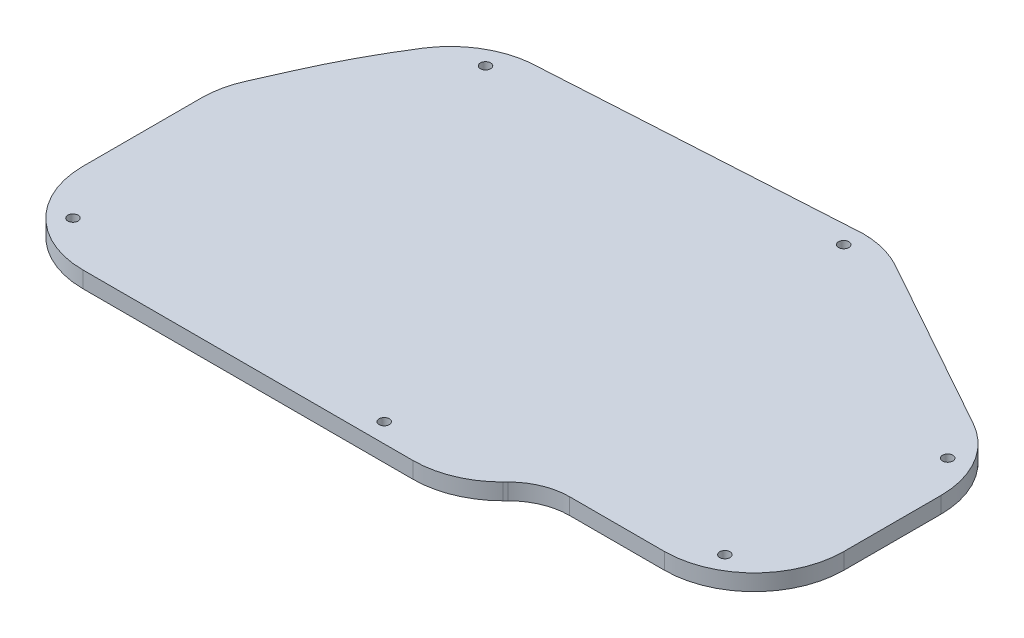
ISO-10303-21;
HEADER;
FILE_DESCRIPTION(('STEP AP214'),'2;1');
FILE_NAME('part.step','',(''),(''),'','','');
FILE_SCHEMA(('AUTOMOTIVE_DESIGN { 1 0 10303 214 1 1 1 1 }'));
ENDSEC;
DATA;
#1=APPLICATION_CONTEXT('core data for automotive mechanical design processes');
#2=APPLICATION_PROTOCOL_DEFINITION('international standard','automotive_design',2000,#1);
#3=PRODUCT_CONTEXT('',#1,'mechanical');
#4=PRODUCT('Part','Part','',(#3));
#5=PRODUCT_RELATED_PRODUCT_CATEGORY('part','',(#4));
#6=PRODUCT_DEFINITION_FORMATION('','',#4);
#7=PRODUCT_DEFINITION_CONTEXT('part definition',#1,'design');
#8=PRODUCT_DEFINITION('design','',#6,#7);
#9=PRODUCT_DEFINITION_SHAPE('','',#8);
#10=(LENGTH_UNIT() NAMED_UNIT(*) SI_UNIT(.MILLI.,.METRE.));
#11=(NAMED_UNIT(*) PLANE_ANGLE_UNIT() SI_UNIT($,.RADIAN.));
#12=(NAMED_UNIT(*) SI_UNIT($,.STERADIAN.) SOLID_ANGLE_UNIT());
#13=UNCERTAINTY_MEASURE_WITH_UNIT(LENGTH_MEASURE(1.E-05),#10,'distance_accuracy_value','');
#14=(GEOMETRIC_REPRESENTATION_CONTEXT(3) GLOBAL_UNCERTAINTY_ASSIGNED_CONTEXT((#13)) GLOBAL_UNIT_ASSIGNED_CONTEXT((#10,
#11,#12)) REPRESENTATION_CONTEXT('',''));
#15=CARTESIAN_POINT('',(0.,0.,0.));
#16=DIRECTION('',(0.,0.,1.));
#17=DIRECTION('',(1.,0.,0.));
#18=AXIS2_PLACEMENT_3D('',#15,#16,#17);
#19=CARTESIAN_POINT('',(-257.825636599929,3.175,88.130010280707));
#20=DIRECTION('',(0.,1.,0.));
#21=DIRECTION('',(0.,0.,1.));
#22=AXIS2_PLACEMENT_3D('',#19,#20,#21);
#23=PLANE('',#22);
#24=CARTESIAN_POINT('',(-267.548354841244,3.175,97.8527285220219));
#25=DIRECTION('',(0.,1.,0.));
#26=DIRECTION('',(0.,0.,1.));
#27=AXIS2_PLACEMENT_3D('',#24,#25,#26);
#28=CIRCLE('',#27,0.999999999999998);
#29=CARTESIAN_POINT('',(-267.548354841244,3.175,98.8527285220219));
#30=VERTEX_POINT('',#29);
#31=EDGE_CURVE('E368',#30,#30,#28,.T.);
#32=ORIENTED_EDGE('',*,*,#31,.F.);
#33=EDGE_LOOP('',(#32));
#34=FACE_BOUND('',#33,.T.);
#35=CARTESIAN_POINT('',(-187.963906245359,3.175,27.219493821026));
#36=DIRECTION('',(0.,1.,0.));
#37=DIRECTION('',(0.,0.,1.));
#38=AXIS2_PLACEMENT_3D('',#35,#36,#37);
#39=CIRCLE('',#38,0.999999999999998);
#40=CARTESIAN_POINT('',(-187.963906245359,3.175,28.2194938210259));
#41=VERTEX_POINT('',#40);
#42=EDGE_CURVE('E380',#41,#41,#39,.T.);
#43=ORIENTED_EDGE('',*,*,#42,.F.);
#44=EDGE_LOOP('',(#43));
#45=FACE_BOUND('',#44,.T.);
#46=CARTESIAN_POINT('',(-147.207602144608,3.175,91.1272884977668));
#47=DIRECTION('',(0.,1.,0.));
#48=DIRECTION('',(0.,0.,1.));
#49=AXIS2_PLACEMENT_3D('',#46,#47,#48);
#50=CIRCLE('',#49,0.999999999999998);
#51=CARTESIAN_POINT('',(-147.207602144608,3.175,92.1272884977668));
#52=VERTEX_POINT('',#51);
#53=EDGE_CURVE('E192',#52,#52,#50,.T.);
#54=ORIENTED_EDGE('',*,*,#53,.F.);
#55=EDGE_LOOP('',(#54));
#56=FACE_BOUND('',#55,.T.);
#57=CARTESIAN_POINT('',(-257.825636599929,3.175,88.130010280707));
#58=DIRECTION('',(0.,1.,0.));
#59=DIRECTION('',(0.,0.,1.));
#60=AXIS2_PLACEMENT_3D('',#57,#58,#59);
#61=CIRCLE('',#60,17.5);
#62=CARTESIAN_POINT('',(-275.325636599929,3.175,88.1300102807068));
#63=VERTEX_POINT('',#62);
#64=CARTESIAN_POINT('',(-257.825636599926,3.175,105.630010280707));
#65=VERTEX_POINT('',#64);
#66=EDGE_CURVE('E221',#63,#65,#61,.T.);
#67=ORIENTED_EDGE('',*,*,#66,.T.);
#68=DIRECTION('',(1.,0.,0.));
#69=VECTOR('',#68,1.);
#70=CARTESIAN_POINT('',(-257.825636599926,3.175,105.630010280707));
#71=LINE('',#70,#69);
#72=CARTESIAN_POINT('',(-193.494425739186,3.175,105.630010280707));
#73=VERTEX_POINT('',#72);
#74=EDGE_CURVE('E124',#65,#73,#71,.T.);
#75=ORIENTED_EDGE('',*,*,#74,.T.);
#76=CARTESIAN_POINT('',(-193.494425739186,3.175,88.130010280707));
#77=DIRECTION('',(0.,1.,0.));
#78=DIRECTION('',(0.,0.,1.));
#79=AXIS2_PLACEMENT_3D('',#76,#77,#78);
#80=CIRCLE('',#79,17.5);
#81=CARTESIAN_POINT('',(-181.120057068421,3.175,100.504378951472));
#82=VERTEX_POINT('',#81);
#83=EDGE_CURVE('E263',#73,#82,#80,.T.);
#84=ORIENTED_EDGE('',*,*,#83,.T.);
#85=DIRECTION('',(0.707106781186528,0.,-0.707106781186567));
#86=VECTOR('',#85,1.);
#87=CARTESIAN_POINT('',(-181.120057068421,3.175,100.504378951472));
#88=LINE('',#87,#86);
#89=CARTESIAN_POINT('',(-180.610104454432,3.175,99.9944263374824));
#90=VERTEX_POINT('',#89);
#91=EDGE_CURVE('E282',#82,#90,#88,.T.);
#92=ORIENTED_EDGE('',*,*,#91,.T.);
#93=CARTESIAN_POINT('',(-172.124823080193,3.175,108.479707711721));
#94=DIRECTION('',(0.,-1.,0.));
#95=DIRECTION('',(0.,0.,1.));
#96=AXIS2_PLACEMENT_3D('',#93,#94,#95);
#97=CIRCLE('',#96,12.);
#98=CARTESIAN_POINT('',(-172.124823080193,3.175,96.4797077117209));
#99=VERTEX_POINT('',#98);
#100=EDGE_CURVE('E279',#90,#99,#97,.T.);
#101=ORIENTED_EDGE('',*,*,#100,.T.);
#102=DIRECTION('',(1.,0.,0.));
#103=VECTOR('',#102,1.);
#104=CARTESIAN_POINT('',(-172.124823080193,3.175,96.4797077117209));
#105=LINE('',#104,#103);
#106=CARTESIAN_POINT('',(-153.649556898133,3.175,96.4797077117206));
#107=VERTEX_POINT('',#106);
#108=EDGE_CURVE('E281',#99,#107,#105,.T.);
#109=ORIENTED_EDGE('',*,*,#108,.T.);
#110=CARTESIAN_POINT('',(-153.649556898131,3.175,78.9797077117209));
#111=DIRECTION('',(0.,1.,0.));
#112=DIRECTION('',(0.,0.,1.));
#113=AXIS2_PLACEMENT_3D('',#110,#111,#112);
#114=CIRCLE('',#113,17.4999999999996);
#115=CARTESIAN_POINT('',(-136.149556898132,3.175,78.979707711718));
#116=VERTEX_POINT('',#115);
#117=EDGE_CURVE('E284',#107,#116,#114,.T.);
#118=ORIENTED_EDGE('',*,*,#117,.T.);
#119=DIRECTION('',(0.,0.,-1.));
#120=VECTOR('',#119,1.);
#121=CARTESIAN_POINT('',(-136.149556898132,3.175,78.979707711718));
#122=LINE('',#121,#120);
#123=CARTESIAN_POINT('',(-136.149556898131,3.175,60.0820712296497));
#124=VERTEX_POINT('',#123);
#125=EDGE_CURVE('E290',#116,#124,#122,.T.);
#126=ORIENTED_EDGE('',*,*,#125,.T.);
#127=CARTESIAN_POINT('',(-153.649556898131,3.175,60.0820712296482));
#128=DIRECTION('',(0.,1.,0.));
#129=DIRECTION('',(0.,0.,1.));
#130=AXIS2_PLACEMENT_3D('',#127,#128,#129);
#131=CIRCLE('',#130,17.5);
#132=CARTESIAN_POINT('',(-145.134111059737,3.175,44.7936055717288));
#133=VERTEX_POINT('',#132);
#134=EDGE_CURVE('E292',#124,#133,#131,.T.);
#135=ORIENTED_EDGE('',*,*,#134,.T.);
#136=DIRECTION('',(-0.873626609023966,0.,-0.486596905051077));
#137=VECTOR('',#136,1.);
#138=CARTESIAN_POINT('',(-145.134111059737,3.175,44.7936055717288));
#139=LINE('',#138,#137);
#140=CARTESIAN_POINT('',(-179.448460406965,3.175,25.6810281631066));
#141=VERTEX_POINT('',#140);
#142=EDGE_CURVE('E294',#133,#141,#139,.T.);
#143=ORIENTED_EDGE('',*,*,#142,.T.);
#144=CARTESIAN_POINT('',(-187.963906245359,3.175,40.9694938210259));
#145=DIRECTION('',(0.,1.,0.));
#146=DIRECTION('',(0.,0.,1.));
#147=AXIS2_PLACEMENT_3D('',#144,#145,#146);
#148=CIRCLE('',#147,17.5);
#149=CARTESIAN_POINT('',(-187.963906245359,3.175,23.4694938210259));
#150=VERTEX_POINT('',#149);
#151=EDGE_CURVE('E296',#141,#150,#148,.T.);
#152=ORIENTED_EDGE('',*,*,#151,.T.);
#153=DIRECTION('',(-0.99827097221074,0.,0.058779809811052));
#154=VECTOR('',#153,1.);
#155=CARTESIAN_POINT('',(-187.963906245359,3.175,23.4694938210259));
#156=LINE('',#155,#154);
#157=CARTESIAN_POINT('',(-247.380541868139,3.175,26.9680414486157));
#158=VERTEX_POINT('',#157);
#159=EDGE_CURVE('E298',#150,#158,#156,.T.);
#160=ORIENTED_EDGE('',*,*,#159,.T.);
#161=CARTESIAN_POINT('',(-247.380541868139,3.175,44.4680414486157));
#162=DIRECTION('',(0.,1.,0.));
#163=DIRECTION('',(0.,0.,1.));
#164=AXIS2_PLACEMENT_3D('',#161,#162,#163);
#165=CIRCLE('',#164,17.5);
#166=CARTESIAN_POINT('',(-262.154750086511,3.175,35.0886613240974));
#167=VERTEX_POINT('',#166);
#168=EDGE_CURVE('E300',#158,#167,#165,.T.);
#169=ORIENTED_EDGE('',*,*,#168,.T.);
#170=CARTESIAN_POINT('',(-154.715336031883,3.175,103.29638453195));
#171=DIRECTION('',(0.,1.,0.));
#172=DIRECTION('',(0.,0.,1.));
#173=AXIS2_PLACEMENT_3D('',#170,#171,#172);
#174=CIRCLE('',#173,127.261624999844);
#175=CARTESIAN_POINT('',(-271.025140144185,3.175,51.6480480150906));
#176=VERTEX_POINT('',#175);
#177=EDGE_CURVE('E170',#167,#176,#174,.T.);
#178=ORIENTED_EDGE('',*,*,#177,.T.);
#179=DIRECTION('',(-0.405843760968182,0.,0.913942471758043));
#180=VECTOR('',#179,1.);
#181=CARTESIAN_POINT('',(-271.025140144185,3.175,51.6480480150906));
#182=LINE('',#181,#180);
#183=CARTESIAN_POINT('',(-273.819629855694,3.175,57.9411171216515));
#184=VERTEX_POINT('',#183);
#185=EDGE_CURVE('E164',#176,#184,#182,.T.);
#186=ORIENTED_EDGE('',*,*,#185,.T.);
#187=CARTESIAN_POINT('',(-257.825636599929,3.175,65.0433829385948));
#188=DIRECTION('',(0.,1.,0.));
#189=DIRECTION('',(0.,0.,1.));
#190=AXIS2_PLACEMENT_3D('',#187,#188,#189);
#191=CIRCLE('',#190,17.5);
#192=CARTESIAN_POINT('',(-275.325636599929,3.175,65.0433829385949));
#193=VERTEX_POINT('',#192);
#194=EDGE_CURVE('E168',#184,#193,#191,.T.);
#195=ORIENTED_EDGE('',*,*,#194,.T.);
#196=DIRECTION('',(0.,0.,1.));
#197=VECTOR('',#196,1.);
#198=CARTESIAN_POINT('',(-275.325636599929,3.175,65.0433829385949));
#199=LINE('',#198,#197);
#200=EDGE_CURVE('E54',#193,#63,#199,.T.);
#201=ORIENTED_EDGE('',*,*,#200,.T.);
#202=EDGE_LOOP('',(#67,#75,#84,#92,#101,#109,#118,#126,#135,#143,#152,#160,#169,#178,#186,#195,#201));
#203=FACE_BOUND('',#202,.T.);
#204=CARTESIAN_POINT('',(-141.795027650598,3.175,53.1155343339314));
#205=DIRECTION('',(0.,1.,0.));
#206=DIRECTION('',(0.,0.,1.));
#207=AXIS2_PLACEMENT_3D('',#204,#205,#206);
#208=CIRCLE('',#207,0.999999999999998);
#209=CARTESIAN_POINT('',(-141.795027650598,3.175,54.1155343339314));
#210=VERTEX_POINT('',#209);
#211=EDGE_CURVE('E386',#210,#210,#208,.T.);
#212=ORIENTED_EDGE('',*,*,#211,.F.);
#213=EDGE_LOOP('',(#212));
#214=FACE_BOUND('',#213,.T.);
#215=CARTESIAN_POINT('',(-253.051529835332,3.175,31.9419728125291));
#216=DIRECTION('',(0.,1.,0.));
#217=DIRECTION('',(0.,0.,1.));
#218=AXIS2_PLACEMENT_3D('',#215,#216,#217);
#219=CIRCLE('',#218,0.999999999999998);
#220=CARTESIAN_POINT('',(-253.051529835332,3.175,32.9419728125291));
#221=VERTEX_POINT('',#220);
#222=EDGE_CURVE('E374',#221,#221,#219,.T.);
#223=ORIENTED_EDGE('',*,*,#222,.F.);
#224=EDGE_LOOP('',(#223));
#225=FACE_BOUND('',#224,.T.);
#226=CARTESIAN_POINT('',(-202.85468143992,3.175,101.880010280707));
#227=DIRECTION('',(0.,1.,0.));
#228=DIRECTION('',(0.,0.,1.));
#229=AXIS2_PLACEMENT_3D('',#226,#227,#228);
#230=CIRCLE('',#229,0.999999999999998);
#231=CARTESIAN_POINT('',(-202.85468143992,3.175,102.880010280707));
#232=VERTEX_POINT('',#231);
#233=EDGE_CURVE('E359',#232,#232,#230,.T.);
#234=ORIENTED_EDGE('',*,*,#233,.F.);
#235=EDGE_LOOP('',(#234));
#236=FACE_BOUND('',#235,.T.);
#237=ADVANCED_FACE('F37',(#34,#45,#56,#203,#214,#225,#236),#23,.T.);
#238=CARTESIAN_POINT('',(-257.825636599929,0.,88.130010280707));
#239=DIRECTION('',(0.,1.,0.));
#240=DIRECTION('',(0.,0.,1.));
#241=AXIS2_PLACEMENT_3D('',#238,#239,#240);
#242=PLANE('',#241);
#243=CARTESIAN_POINT('',(-257.825636599929,0.,88.130010280707));
#244=DIRECTION('',(0.,1.,0.));
#245=DIRECTION('',(0.,0.,1.));
#246=AXIS2_PLACEMENT_3D('',#243,#244,#245);
#247=CIRCLE('',#246,17.5);
#248=CARTESIAN_POINT('',(-275.325636599929,0.,88.1300102807068));
#249=VERTEX_POINT('',#248);
#250=CARTESIAN_POINT('',(-257.825636599926,0.,105.630010280707));
#251=VERTEX_POINT('',#250);
#252=EDGE_CURVE('E188',#249,#251,#247,.T.);
#253=ORIENTED_EDGE('',*,*,#252,.F.);
#254=DIRECTION('',(0.,0.,1.));
#255=VECTOR('',#254,1.);
#256=CARTESIAN_POINT('',(-275.325636599929,0.,65.0433829385949));
#257=LINE('',#256,#255);
#258=CARTESIAN_POINT('',(-275.325636599929,0.,65.0433829385949));
#259=VERTEX_POINT('',#258);
#260=EDGE_CURVE('E116',#259,#249,#257,.T.);
#261=ORIENTED_EDGE('',*,*,#260,.F.);
#262=CARTESIAN_POINT('',(-257.825636599929,0.,65.0433829385948));
#263=DIRECTION('',(0.,1.,0.));
#264=DIRECTION('',(0.,0.,1.));
#265=AXIS2_PLACEMENT_3D('',#262,#263,#264);
#266=CIRCLE('',#265,17.5);
#267=CARTESIAN_POINT('',(-273.819629855694,0.,57.9411171216515));
#268=VERTEX_POINT('',#267);
#269=EDGE_CURVE('E110',#268,#259,#266,.T.);
#270=ORIENTED_EDGE('',*,*,#269,.F.);
#271=DIRECTION('',(-0.405843760968182,0.,0.913942471758043));
#272=VECTOR('',#271,1.);
#273=CARTESIAN_POINT('',(-271.025140144185,0.,51.6480480150906));
#274=LINE('',#273,#272);
#275=CARTESIAN_POINT('',(-271.025140144185,0.,51.6480480150906));
#276=VERTEX_POINT('',#275);
#277=EDGE_CURVE('E178',#276,#268,#274,.T.);
#278=ORIENTED_EDGE('',*,*,#277,.F.);
#279=CARTESIAN_POINT('',(-154.715336031883,0.,103.29638453195));
#280=DIRECTION('',(0.,1.,0.));
#281=DIRECTION('',(0.,0.,1.));
#282=AXIS2_PLACEMENT_3D('',#279,#280,#281);
#283=CIRCLE('',#282,127.261624999844);
#284=CARTESIAN_POINT('',(-262.154750086511,0.,35.0886613240974));
#285=VERTEX_POINT('',#284);
#286=EDGE_CURVE('E216',#285,#276,#283,.T.);
#287=ORIENTED_EDGE('',*,*,#286,.F.);
#288=CARTESIAN_POINT('',(-247.380541868139,0.,44.4680414486157));
#289=DIRECTION('',(0.,1.,0.));
#290=DIRECTION('',(0.,0.,1.));
#291=AXIS2_PLACEMENT_3D('',#288,#289,#290);
#292=CIRCLE('',#291,17.5);
#293=CARTESIAN_POINT('',(-247.380541868139,0.,26.9680414486157));
#294=VERTEX_POINT('',#293);
#295=EDGE_CURVE('E214',#294,#285,#292,.T.);
#296=ORIENTED_EDGE('',*,*,#295,.F.);
#297=DIRECTION('',(-0.99827097221074,0.,0.058779809811052));
#298=VECTOR('',#297,1.);
#299=CARTESIAN_POINT('',(-187.963906245359,0.,23.4694938210259));
#300=LINE('',#299,#298);
#301=CARTESIAN_POINT('',(-187.963906245359,0.,23.4694938210259));
#302=VERTEX_POINT('',#301);
#303=EDGE_CURVE('E212',#302,#294,#300,.T.);
#304=ORIENTED_EDGE('',*,*,#303,.F.);
#305=CARTESIAN_POINT('',(-187.963906245359,0.,40.9694938210259));
#306=DIRECTION('',(0.,1.,0.));
#307=DIRECTION('',(0.,0.,1.));
#308=AXIS2_PLACEMENT_3D('',#305,#306,#307);
#309=CIRCLE('',#308,17.5);
#310=CARTESIAN_POINT('',(-179.448460406965,0.,25.6810281631066));
#311=VERTEX_POINT('',#310);
#312=EDGE_CURVE('E210',#311,#302,#309,.T.);
#313=ORIENTED_EDGE('',*,*,#312,.F.);
#314=DIRECTION('',(-0.873626609023966,0.,-0.486596905051077));
#315=VECTOR('',#314,1.);
#316=CARTESIAN_POINT('',(-145.134111059737,0.,44.7936055717288));
#317=LINE('',#316,#315);
#318=CARTESIAN_POINT('',(-145.134111059737,0.,44.7936055717288));
#319=VERTEX_POINT('',#318);
#320=EDGE_CURVE('E208',#319,#311,#317,.T.);
#321=ORIENTED_EDGE('',*,*,#320,.F.);
#322=CARTESIAN_POINT('',(-153.649556898131,0.,60.0820712296482));
#323=DIRECTION('',(0.,1.,0.));
#324=DIRECTION('',(0.,0.,1.));
#325=AXIS2_PLACEMENT_3D('',#322,#323,#324);
#326=CIRCLE('',#325,17.5);
#327=CARTESIAN_POINT('',(-136.149556898131,0.,60.0820712296497));
#328=VERTEX_POINT('',#327);
#329=EDGE_CURVE('E206',#328,#319,#326,.T.);
#330=ORIENTED_EDGE('',*,*,#329,.F.);
#331=DIRECTION('',(0.,0.,-1.));
#332=VECTOR('',#331,1.);
#333=CARTESIAN_POINT('',(-136.149556898132,0.,78.979707711718));
#334=LINE('',#333,#332);
#335=CARTESIAN_POINT('',(-136.149556898132,0.,78.979707711718));
#336=VERTEX_POINT('',#335);
#337=EDGE_CURVE('E204',#336,#328,#334,.T.);
#338=ORIENTED_EDGE('',*,*,#337,.F.);
#339=CARTESIAN_POINT('',(-153.649556898131,0.,78.9797077117209));
#340=DIRECTION('',(0.,1.,0.));
#341=DIRECTION('',(0.,0.,1.));
#342=AXIS2_PLACEMENT_3D('',#339,#340,#341);
#343=CIRCLE('',#342,17.4999999999996);
#344=CARTESIAN_POINT('',(-153.649556898133,0.,96.4797077117206));
#345=VERTEX_POINT('',#344);
#346=EDGE_CURVE('E202',#345,#336,#343,.T.);
#347=ORIENTED_EDGE('',*,*,#346,.F.);
#348=DIRECTION('',(1.,0.,0.));
#349=VECTOR('',#348,1.);
#350=CARTESIAN_POINT('',(-172.124823080193,0.,96.4797077117209));
#351=LINE('',#350,#349);
#352=CARTESIAN_POINT('',(-172.124823080193,0.,96.4797077117209));
#353=VERTEX_POINT('',#352);
#354=EDGE_CURVE('E200',#353,#345,#351,.T.);
#355=ORIENTED_EDGE('',*,*,#354,.F.);
#356=CARTESIAN_POINT('',(-172.124823080193,0.,108.479707711721));
#357=DIRECTION('',(0.,-1.,0.));
#358=DIRECTION('',(0.,0.,1.));
#359=AXIS2_PLACEMENT_3D('',#356,#357,#358);
#360=CIRCLE('',#359,12.);
#361=CARTESIAN_POINT('',(-180.610104454432,0.,99.9944263374824));
#362=VERTEX_POINT('',#361);
#363=EDGE_CURVE('E198',#362,#353,#360,.T.);
#364=ORIENTED_EDGE('',*,*,#363,.F.);
#365=DIRECTION('',(0.707106781186528,0.,-0.707106781186567));
#366=VECTOR('',#365,1.);
#367=CARTESIAN_POINT('',(-181.120057068421,0.,100.504378951472));
#368=LINE('',#367,#366);
#369=CARTESIAN_POINT('',(-181.120057068421,0.,100.504378951472));
#370=VERTEX_POINT('',#369);
#371=EDGE_CURVE('E196',#370,#362,#368,.T.);
#372=ORIENTED_EDGE('',*,*,#371,.F.);
#373=CARTESIAN_POINT('',(-193.494425739186,0.,88.130010280707));
#374=DIRECTION('',(0.,1.,0.));
#375=DIRECTION('',(0.,0.,1.));
#376=AXIS2_PLACEMENT_3D('',#373,#374,#375);
#377=CIRCLE('',#376,17.5);
#378=CARTESIAN_POINT('',(-193.494425739186,0.,105.630010280707));
#379=VERTEX_POINT('',#378);
#380=EDGE_CURVE('E194',#379,#370,#377,.T.);
#381=ORIENTED_EDGE('',*,*,#380,.F.);
#382=DIRECTION('',(1.,0.,0.));
#383=VECTOR('',#382,1.);
#384=CARTESIAN_POINT('',(-257.825636599926,0.,105.630010280707));
#385=LINE('',#384,#383);
#386=EDGE_CURVE('E191',#251,#379,#385,.T.);
#387=ORIENTED_EDGE('',*,*,#386,.F.);
#388=EDGE_LOOP('',(#253,#261,#270,#278,#287,#296,#304,#313,#321,#330,#338,#347,#355,#364,#372,
#381,#387));
#389=FACE_BOUND('',#388,.T.);
#390=CARTESIAN_POINT('',(-147.207602144608,0.,91.1272884977668));
#391=DIRECTION('',(0.,1.,0.));
#392=DIRECTION('',(0.,0.,1.));
#393=AXIS2_PLACEMENT_3D('',#390,#391,#392);
#394=CIRCLE('',#393,0.999999999999998);
#395=CARTESIAN_POINT('',(-147.207602144608,0.,92.1272884977668));
#396=VERTEX_POINT('',#395);
#397=EDGE_CURVE('E389',#396,#396,#394,.T.);
#398=ORIENTED_EDGE('',*,*,#397,.T.);
#399=EDGE_LOOP('',(#398));
#400=FACE_BOUND('',#399,.T.);
#401=CARTESIAN_POINT('',(-141.795027650598,0.,53.1155343339314));
#402=DIRECTION('',(0.,1.,0.));
#403=DIRECTION('',(0.,0.,1.));
#404=AXIS2_PLACEMENT_3D('',#401,#402,#403);
#405=CIRCLE('',#404,0.999999999999998);
#406=CARTESIAN_POINT('',(-141.795027650598,0.,54.1155343339314));
#407=VERTEX_POINT('',#406);
#408=EDGE_CURVE('E383',#407,#407,#405,.T.);
#409=ORIENTED_EDGE('',*,*,#408,.T.);
#410=EDGE_LOOP('',(#409));
#411=FACE_BOUND('',#410,.T.);
#412=CARTESIAN_POINT('',(-187.963906245359,0.,27.219493821026));
#413=DIRECTION('',(0.,1.,0.));
#414=DIRECTION('',(0.,0.,1.));
#415=AXIS2_PLACEMENT_3D('',#412,#413,#414);
#416=CIRCLE('',#415,0.999999999999998);
#417=CARTESIAN_POINT('',(-187.963906245359,0.,28.2194938210259));
#418=VERTEX_POINT('',#417);
#419=EDGE_CURVE('E377',#418,#418,#416,.T.);
#420=ORIENTED_EDGE('',*,*,#419,.T.);
#421=EDGE_LOOP('',(#420));
#422=FACE_BOUND('',#421,.T.);
#423=CARTESIAN_POINT('',(-253.051529835332,0.,31.9419728125291));
#424=DIRECTION('',(0.,1.,0.));
#425=DIRECTION('',(0.,0.,1.));
#426=AXIS2_PLACEMENT_3D('',#423,#424,#425);
#427=CIRCLE('',#426,0.999999999999998);
#428=CARTESIAN_POINT('',(-253.051529835332,0.,32.9419728125291));
#429=VERTEX_POINT('',#428);
#430=EDGE_CURVE('E371',#429,#429,#427,.T.);
#431=ORIENTED_EDGE('',*,*,#430,.T.);
#432=EDGE_LOOP('',(#431));
#433=FACE_BOUND('',#432,.T.);
#434=CARTESIAN_POINT('',(-267.548354841244,0.,97.8527285220219));
#435=DIRECTION('',(0.,1.,0.));
#436=DIRECTION('',(0.,0.,1.));
#437=AXIS2_PLACEMENT_3D('',#434,#435,#436);
#438=CIRCLE('',#437,0.999999999999998);
#439=CARTESIAN_POINT('',(-267.548354841244,0.,98.8527285220219));
#440=VERTEX_POINT('',#439);
#441=EDGE_CURVE('E365',#440,#440,#438,.T.);
#442=ORIENTED_EDGE('',*,*,#441,.T.);
#443=EDGE_LOOP('',(#442));
#444=FACE_BOUND('',#443,.T.);
#445=CARTESIAN_POINT('',(-202.85468143992,0.,101.880010280707));
#446=DIRECTION('',(0.,1.,0.));
#447=DIRECTION('',(0.,0.,1.));
#448=AXIS2_PLACEMENT_3D('',#445,#446,#447);
#449=CIRCLE('',#448,0.999999999999998);
#450=CARTESIAN_POINT('',(-202.85468143992,0.,102.880010280707));
#451=VERTEX_POINT('',#450);
#452=EDGE_CURVE('E362',#451,#451,#449,.T.);
#453=ORIENTED_EDGE('',*,*,#452,.T.);
#454=EDGE_LOOP('',(#453));
#455=FACE_BOUND('',#454,.T.);
#456=ADVANCED_FACE('F267',(#389,#400,#411,#422,#433,#444,#455),#242,.F.);
#457=CARTESIAN_POINT('',(-257.825636599929,3.175,88.130010280707));
#458=DIRECTION('',(0.,-1.,0.));
#459=DIRECTION('',(0.,0.,-1.));
#460=AXIS2_PLACEMENT_3D('',#457,#458,#459);
#461=CYLINDRICAL_SURFACE('',#460,17.5);
#462=ORIENTED_EDGE('',*,*,#252,.T.);
#463=DIRECTION('',(0.,-1.,0.));
#464=VECTOR('',#463,1.);
#465=CARTESIAN_POINT('',(-257.825636599926,3.175,105.630010280707));
#466=LINE('',#465,#464);
#467=EDGE_CURVE('E11',#65,#251,#466,.T.);
#468=ORIENTED_EDGE('',*,*,#467,.F.);
#469=ORIENTED_EDGE('',*,*,#66,.F.);
#470=DIRECTION('',(0.,-1.,0.));
#471=VECTOR('',#470,1.);
#472=CARTESIAN_POINT('',(-275.325636599929,3.175,88.1300102807068));
#473=LINE('',#472,#471);
#474=EDGE_CURVE('E184',#63,#249,#473,.T.);
#475=ORIENTED_EDGE('',*,*,#474,.T.);
#476=EDGE_LOOP('',(#462,#468,#469,#475));
#477=FACE_BOUND('',#476,.T.);
#478=ADVANCED_FACE('F39',(#477),#461,.T.);
#479=CARTESIAN_POINT('',(-257.825636599926,3.175,105.630010280707));
#480=DIRECTION('',(0.,0.,-1.));
#481=DIRECTION('',(-1.,0.,0.));
#482=AXIS2_PLACEMENT_3D('',#479,#480,#481);
#483=PLANE('',#482);
#484=ORIENTED_EDGE('',*,*,#386,.T.);
#485=DIRECTION('',(0.,-1.,0.));
#486=VECTOR('',#485,1.);
#487=CARTESIAN_POINT('',(-193.494425739186,3.175,105.630010280707));
#488=LINE('',#487,#486);
#489=EDGE_CURVE('E46',#73,#379,#488,.T.);
#490=ORIENTED_EDGE('',*,*,#489,.F.);
#491=ORIENTED_EDGE('',*,*,#74,.F.);
#492=ORIENTED_EDGE('',*,*,#467,.T.);
#493=EDGE_LOOP('',(#484,#490,#491,#492));
#494=FACE_BOUND('',#493,.T.);
#495=ADVANCED_FACE('F567',(#494),#483,.F.);
#496=CARTESIAN_POINT('',(-193.494425739186,3.175,88.130010280707));
#497=DIRECTION('',(0.,-1.,0.));
#498=DIRECTION('',(0.,0.,-1.));
#499=AXIS2_PLACEMENT_3D('',#496,#497,#498);
#500=CYLINDRICAL_SURFACE('',#499,17.5);
#501=ORIENTED_EDGE('',*,*,#380,.T.);
#502=DIRECTION('',(0.,-1.,0.));
#503=VECTOR('',#502,1.);
#504=CARTESIAN_POINT('',(-181.120057068421,3.175,100.504378951472));
#505=LINE('',#504,#503);
#506=EDGE_CURVE('E255',#82,#370,#505,.T.);
#507=ORIENTED_EDGE('',*,*,#506,.F.);
#508=ORIENTED_EDGE('',*,*,#83,.F.);
#509=ORIENTED_EDGE('',*,*,#489,.T.);
#510=EDGE_LOOP('',(#501,#507,#508,#509));
#511=FACE_BOUND('',#510,.T.);
#512=ADVANCED_FACE('F261',(#511),#500,.T.);
#513=CARTESIAN_POINT('',(-181.120057068421,3.175,100.504378951472));
#514=DIRECTION('',(-0.707106781186567,0.,-0.707106781186528));
#515=DIRECTION('',(-0.707106781186528,0.,0.707106781186567));
#516=AXIS2_PLACEMENT_3D('',#513,#514,#515);
#517=PLANE('',#516);
#518=ORIENTED_EDGE('',*,*,#371,.T.);
#519=DIRECTION('',(0.,-1.,0.));
#520=VECTOR('',#519,1.);
#521=CARTESIAN_POINT('',(-180.610104454432,3.175,99.9944263374824));
#522=LINE('',#521,#520);
#523=EDGE_CURVE('E252',#90,#362,#522,.T.);
#524=ORIENTED_EDGE('',*,*,#523,.F.);
#525=ORIENTED_EDGE('',*,*,#91,.F.);
#526=ORIENTED_EDGE('',*,*,#506,.T.);
#527=EDGE_LOOP('',(#518,#524,#525,#526));
#528=FACE_BOUND('',#527,.T.);
#529=ADVANCED_FACE('F273',(#528),#517,.F.);
#530=CARTESIAN_POINT('',(-172.124823080193,3.175,108.479707711721));
#531=DIRECTION('',(0.,-1.,0.));
#532=DIRECTION('',(0.,0.,-1.));
#533=AXIS2_PLACEMENT_3D('',#530,#531,#532);
#534=CYLINDRICAL_SURFACE('',#533,12.);
#535=ORIENTED_EDGE('',*,*,#363,.T.);
#536=DIRECTION('',(0.,-1.,0.));
#537=VECTOR('',#536,1.);
#538=CARTESIAN_POINT('',(-172.124823080193,3.175,96.4797077117209));
#539=LINE('',#538,#537);
#540=EDGE_CURVE('E249',#99,#353,#539,.T.);
#541=ORIENTED_EDGE('',*,*,#540,.F.);
#542=ORIENTED_EDGE('',*,*,#100,.F.);
#543=ORIENTED_EDGE('',*,*,#523,.T.);
#544=EDGE_LOOP('',(#535,#541,#542,#543));
#545=FACE_BOUND('',#544,.T.);
#546=ADVANCED_FACE('F277',(#545),#534,.F.);
#547=CARTESIAN_POINT('',(-172.124823080193,3.175,96.4797077117209));
#548=DIRECTION('',(0.,0.,-1.));
#549=DIRECTION('',(-1.,0.,0.));
#550=AXIS2_PLACEMENT_3D('',#547,#548,#549);
#551=PLANE('',#550);
#552=ORIENTED_EDGE('',*,*,#354,.T.);
#553=DIRECTION('',(0.,-1.,0.));
#554=VECTOR('',#553,1.);
#555=CARTESIAN_POINT('',(-153.649556898133,3.175,96.4797077117206));
#556=LINE('',#555,#554);
#557=EDGE_CURVE('E246',#107,#345,#556,.T.);
#558=ORIENTED_EDGE('',*,*,#557,.F.);
#559=ORIENTED_EDGE('',*,*,#108,.F.);
#560=ORIENTED_EDGE('',*,*,#540,.T.);
#561=EDGE_LOOP('',(#552,#558,#559,#560));
#562=FACE_BOUND('',#561,.T.);
#563=ADVANCED_FACE('F532',(#562),#551,.F.);
#564=CARTESIAN_POINT('',(-153.649556898131,3.175,78.9797077117209));
#565=DIRECTION('',(0.,-1.,0.));
#566=DIRECTION('',(0.,0.,-1.));
#567=AXIS2_PLACEMENT_3D('',#564,#565,#566);
#568=CYLINDRICAL_SURFACE('',#567,17.4999999999996);
#569=ORIENTED_EDGE('',*,*,#346,.T.);
#570=DIRECTION('',(0.,-1.,0.));
#571=VECTOR('',#570,1.);
#572=CARTESIAN_POINT('',(-136.149556898132,3.175,78.979707711718));
#573=LINE('',#572,#571);
#574=EDGE_CURVE('E243',#116,#336,#573,.T.);
#575=ORIENTED_EDGE('',*,*,#574,.F.);
#576=ORIENTED_EDGE('',*,*,#117,.F.);
#577=ORIENTED_EDGE('',*,*,#557,.T.);
#578=EDGE_LOOP('',(#569,#575,#576,#577));
#579=FACE_BOUND('',#578,.T.);
#580=ADVANCED_FACE('F522',(#579),#568,.T.);
#581=CARTESIAN_POINT('',(-136.149556898132,3.175,78.979707711718));
#582=DIRECTION('',(-1.,0.,0.));
#583=DIRECTION('',(0.,0.,1.));
#584=AXIS2_PLACEMENT_3D('',#581,#582,#583);
#585=PLANE('',#584);
#586=ORIENTED_EDGE('',*,*,#337,.T.);
#587=DIRECTION('',(0.,-1.,0.));
#588=VECTOR('',#587,1.);
#589=CARTESIAN_POINT('',(-136.149556898131,3.175,60.0820712296497));
#590=LINE('',#589,#588);
#591=EDGE_CURVE('E240',#124,#328,#590,.T.);
#592=ORIENTED_EDGE('',*,*,#591,.F.);
#593=ORIENTED_EDGE('',*,*,#125,.F.);
#594=ORIENTED_EDGE('',*,*,#574,.T.);
#595=EDGE_LOOP('',(#586,#592,#593,#594));
#596=FACE_BOUND('',#595,.T.);
#597=ADVANCED_FACE('F512',(#596),#585,.F.);
#598=CARTESIAN_POINT('',(-153.649556898131,3.175,60.0820712296482));
#599=DIRECTION('',(0.,-1.,0.));
#600=DIRECTION('',(0.,0.,-1.));
#601=AXIS2_PLACEMENT_3D('',#598,#599,#600);
#602=CYLINDRICAL_SURFACE('',#601,17.5);
#603=ORIENTED_EDGE('',*,*,#329,.T.);
#604=DIRECTION('',(0.,-1.,0.));
#605=VECTOR('',#604,1.);
#606=CARTESIAN_POINT('',(-145.134111059737,3.175,44.7936055717288));
#607=LINE('',#606,#605);
#608=EDGE_CURVE('E237',#133,#319,#607,.T.);
#609=ORIENTED_EDGE('',*,*,#608,.F.);
#610=ORIENTED_EDGE('',*,*,#134,.F.);
#611=ORIENTED_EDGE('',*,*,#591,.T.);
#612=EDGE_LOOP('',(#603,#609,#610,#611));
#613=FACE_BOUND('',#612,.T.);
#614=ADVANCED_FACE('F502',(#613),#602,.T.);
#615=CARTESIAN_POINT('',(-145.134111059737,3.175,44.7936055717288));
#616=DIRECTION('',(-0.486596905051077,0.,0.873626609023966));
#617=DIRECTION('',(0.873626609023966,0.,0.486596905051077));
#618=AXIS2_PLACEMENT_3D('',#615,#616,#617);
#619=PLANE('',#618);
#620=ORIENTED_EDGE('',*,*,#320,.T.);
#621=DIRECTION('',(0.,-1.,0.));
#622=VECTOR('',#621,1.);
#623=CARTESIAN_POINT('',(-179.448460406965,3.175,25.6810281631066));
#624=LINE('',#623,#622);
#625=EDGE_CURVE('E234',#141,#311,#624,.T.);
#626=ORIENTED_EDGE('',*,*,#625,.F.);
#627=ORIENTED_EDGE('',*,*,#142,.F.);
#628=ORIENTED_EDGE('',*,*,#608,.T.);
#629=EDGE_LOOP('',(#620,#626,#627,#628));
#630=FACE_BOUND('',#629,.T.);
#631=ADVANCED_FACE('F492',(#630),#619,.F.);
#632=CARTESIAN_POINT('',(-187.963906245359,3.175,40.9694938210259));
#633=DIRECTION('',(0.,-1.,0.));
#634=DIRECTION('',(0.,0.,-1.));
#635=AXIS2_PLACEMENT_3D('',#632,#633,#634);
#636=CYLINDRICAL_SURFACE('',#635,17.5);
#637=ORIENTED_EDGE('',*,*,#312,.T.);
#638=DIRECTION('',(0.,-1.,0.));
#639=VECTOR('',#638,1.);
#640=CARTESIAN_POINT('',(-187.963906245359,3.175,23.4694938210259));
#641=LINE('',#640,#639);
#642=EDGE_CURVE('E231',#150,#302,#641,.T.);
#643=ORIENTED_EDGE('',*,*,#642,.F.);
#644=ORIENTED_EDGE('',*,*,#151,.F.);
#645=ORIENTED_EDGE('',*,*,#625,.T.);
#646=EDGE_LOOP('',(#637,#643,#644,#645));
#647=FACE_BOUND('',#646,.T.);
#648=ADVANCED_FACE('F482',(#647),#636,.T.);
#649=CARTESIAN_POINT('',(-187.963906245359,3.175,23.4694938210259));
#650=DIRECTION('',(0.058779809811052,0.,0.99827097221074));
#651=DIRECTION('',(0.99827097221074,0.,-0.058779809811052));
#652=AXIS2_PLACEMENT_3D('',#649,#650,#651);
#653=PLANE('',#652);
#654=ORIENTED_EDGE('',*,*,#303,.T.);
#655=DIRECTION('',(0.,-1.,0.));
#656=VECTOR('',#655,1.);
#657=CARTESIAN_POINT('',(-247.380541868139,3.175,26.9680414486157));
#658=LINE('',#657,#656);
#659=EDGE_CURVE('E228',#158,#294,#658,.T.);
#660=ORIENTED_EDGE('',*,*,#659,.F.);
#661=ORIENTED_EDGE('',*,*,#159,.F.);
#662=ORIENTED_EDGE('',*,*,#642,.T.);
#663=EDGE_LOOP('',(#654,#660,#661,#662));
#664=FACE_BOUND('',#663,.T.);
#665=ADVANCED_FACE('F473',(#664),#653,.F.);
#666=CARTESIAN_POINT('',(-247.380541868139,3.175,44.4680414486157));
#667=DIRECTION('',(0.,-1.,0.));
#668=DIRECTION('',(0.,0.,-1.));
#669=AXIS2_PLACEMENT_3D('',#666,#667,#668);
#670=CYLINDRICAL_SURFACE('',#669,17.5);
#671=ORIENTED_EDGE('',*,*,#295,.T.);
#672=DIRECTION('',(0.,-1.,0.));
#673=VECTOR('',#672,1.);
#674=CARTESIAN_POINT('',(-262.154750086511,3.175,35.0886613240974));
#675=LINE('',#674,#673);
#676=EDGE_CURVE('E225',#167,#285,#675,.T.);
#677=ORIENTED_EDGE('',*,*,#676,.F.);
#678=ORIENTED_EDGE('',*,*,#168,.F.);
#679=ORIENTED_EDGE('',*,*,#659,.T.);
#680=EDGE_LOOP('',(#671,#677,#678,#679));
#681=FACE_BOUND('',#680,.T.);
#682=ADVANCED_FACE('F306',(#681),#670,.T.);
#683=CARTESIAN_POINT('',(-154.715336031883,3.175,103.29638453195));
#684=DIRECTION('',(0.,-1.,0.));
#685=DIRECTION('',(0.,0.,-1.));
#686=AXIS2_PLACEMENT_3D('',#683,#684,#685);
#687=CYLINDRICAL_SURFACE('',#686,127.261624999844);
#688=ORIENTED_EDGE('',*,*,#286,.T.);
#689=DIRECTION('',(0.,-1.,0.));
#690=VECTOR('',#689,1.);
#691=CARTESIAN_POINT('',(-271.025140144185,3.175,51.6480480150906));
#692=LINE('',#691,#690);
#693=EDGE_CURVE('E179',#176,#276,#692,.T.);
#694=ORIENTED_EDGE('',*,*,#693,.F.);
#695=ORIENTED_EDGE('',*,*,#177,.F.);
#696=ORIENTED_EDGE('',*,*,#676,.T.);
#697=EDGE_LOOP('',(#688,#694,#695,#696));
#698=FACE_BOUND('',#697,.T.);
#699=ADVANCED_FACE('F310',(#698),#687,.T.);
#700=CARTESIAN_POINT('',(-271.025140144185,3.175,51.6480480150906));
#701=DIRECTION('',(0.913942471758043,0.,0.405843760968182));
#702=DIRECTION('',(0.405843760968183,0.,-0.913942471758043));
#703=AXIS2_PLACEMENT_3D('',#700,#701,#702);
#704=PLANE('',#703);
#705=ORIENTED_EDGE('',*,*,#277,.T.);
#706=DIRECTION('',(0.,-1.,0.));
#707=VECTOR('',#706,1.);
#708=CARTESIAN_POINT('',(-273.819629855694,3.175,57.9411171216515));
#709=LINE('',#708,#707);
#710=EDGE_CURVE('E175',#184,#268,#709,.T.);
#711=ORIENTED_EDGE('',*,*,#710,.F.);
#712=ORIENTED_EDGE('',*,*,#185,.F.);
#713=ORIENTED_EDGE('',*,*,#693,.T.);
#714=EDGE_LOOP('',(#705,#711,#712,#713));
#715=FACE_BOUND('',#714,.T.);
#716=ADVANCED_FACE('F176',(#715),#704,.F.);
#717=CARTESIAN_POINT('',(-257.825636599929,3.175,65.0433829385948));
#718=DIRECTION('',(0.,-1.,0.));
#719=DIRECTION('',(0.,0.,-1.));
#720=AXIS2_PLACEMENT_3D('',#717,#718,#719);
#721=CYLINDRICAL_SURFACE('',#720,17.5);
#722=ORIENTED_EDGE('',*,*,#269,.T.);
#723=DIRECTION('',(0.,-1.,0.));
#724=VECTOR('',#723,1.);
#725=CARTESIAN_POINT('',(-275.325636599929,3.175,65.0433829385949));
#726=LINE('',#725,#724);
#727=EDGE_CURVE('E180',#193,#259,#726,.T.);
#728=ORIENTED_EDGE('',*,*,#727,.F.);
#729=ORIENTED_EDGE('',*,*,#194,.F.);
#730=ORIENTED_EDGE('',*,*,#710,.T.);
#731=EDGE_LOOP('',(#722,#728,#729,#730));
#732=FACE_BOUND('',#731,.T.);
#733=ADVANCED_FACE('F182',(#732),#721,.T.);
#734=CARTESIAN_POINT('',(-275.325636599929,3.175,65.0433829385949));
#735=DIRECTION('',(1.,0.,0.));
#736=DIRECTION('',(0.,0.,-1.));
#737=AXIS2_PLACEMENT_3D('',#734,#735,#736);
#738=PLANE('',#737);
#739=ORIENTED_EDGE('',*,*,#260,.T.);
#740=ORIENTED_EDGE('',*,*,#474,.F.);
#741=ORIENTED_EDGE('',*,*,#200,.F.);
#742=ORIENTED_EDGE('',*,*,#727,.T.);
#743=EDGE_LOOP('',(#739,#740,#741,#742));
#744=FACE_BOUND('',#743,.T.);
#745=ADVANCED_FACE('F314',(#744),#738,.F.);
#746=CARTESIAN_POINT('',(-147.207602144608,3.175,91.1272884977668));
#747=DIRECTION('',(0.,-1.,0.));
#748=DIRECTION('',(0.,0.,-1.));
#749=AXIS2_PLACEMENT_3D('',#746,#747,#748);
#750=CYLINDRICAL_SURFACE('',#749,0.999999999999998);
#751=ORIENTED_EDGE('',*,*,#53,.T.);
#752=EDGE_LOOP('',(#751));
#753=FACE_BOUND('',#752,.T.);
#754=ORIENTED_EDGE('',*,*,#397,.F.);
#755=EDGE_LOOP('',(#754));
#756=FACE_BOUND('',#755,.T.);
#757=ADVANCED_FACE('F316',(#753,#756),#750,.F.);
#758=CARTESIAN_POINT('',(-141.795027650598,3.175,53.1155343339314));
#759=DIRECTION('',(0.,-1.,0.));
#760=DIRECTION('',(0.,0.,-1.));
#761=AXIS2_PLACEMENT_3D('',#758,#759,#760);
#762=CYLINDRICAL_SURFACE('',#761,0.999999999999998);
#763=ORIENTED_EDGE('',*,*,#211,.T.);
#764=EDGE_LOOP('',(#763));
#765=FACE_BOUND('',#764,.T.);
#766=ORIENTED_EDGE('',*,*,#408,.F.);
#767=EDGE_LOOP('',(#766));
#768=FACE_BOUND('',#767,.T.);
#769=ADVANCED_FACE('F322',(#765,#768),#762,.F.);
#770=CARTESIAN_POINT('',(-187.963906245359,3.175,27.219493821026));
#771=DIRECTION('',(0.,-1.,0.));
#772=DIRECTION('',(0.,0.,-1.));
#773=AXIS2_PLACEMENT_3D('',#770,#771,#772);
#774=CYLINDRICAL_SURFACE('',#773,0.999999999999998);
#775=ORIENTED_EDGE('',*,*,#42,.T.);
#776=EDGE_LOOP('',(#775));
#777=FACE_BOUND('',#776,.T.);
#778=ORIENTED_EDGE('',*,*,#419,.F.);
#779=EDGE_LOOP('',(#778));
#780=FACE_BOUND('',#779,.T.);
#781=ADVANCED_FACE('F338',(#777,#780),#774,.F.);
#782=CARTESIAN_POINT('',(-253.051529835332,3.175,31.9419728125291));
#783=DIRECTION('',(0.,-1.,0.));
#784=DIRECTION('',(0.,0.,-1.));
#785=AXIS2_PLACEMENT_3D('',#782,#783,#784);
#786=CYLINDRICAL_SURFACE('',#785,0.999999999999998);
#787=ORIENTED_EDGE('',*,*,#222,.T.);
#788=EDGE_LOOP('',(#787));
#789=FACE_BOUND('',#788,.T.);
#790=ORIENTED_EDGE('',*,*,#430,.F.);
#791=EDGE_LOOP('',(#790));
#792=FACE_BOUND('',#791,.T.);
#793=ADVANCED_FACE('F342',(#789,#792),#786,.F.);
#794=CARTESIAN_POINT('',(-267.548354841244,3.175,97.8527285220219));
#795=DIRECTION('',(0.,-1.,0.));
#796=DIRECTION('',(0.,0.,-1.));
#797=AXIS2_PLACEMENT_3D('',#794,#795,#796);
#798=CYLINDRICAL_SURFACE('',#797,0.999999999999998);
#799=ORIENTED_EDGE('',*,*,#31,.T.);
#800=EDGE_LOOP('',(#799));
#801=FACE_BOUND('',#800,.T.);
#802=ORIENTED_EDGE('',*,*,#441,.F.);
#803=EDGE_LOOP('',(#802));
#804=FACE_BOUND('',#803,.T.);
#805=ADVANCED_FACE('F346',(#801,#804),#798,.F.);
#806=CARTESIAN_POINT('',(-202.85468143992,3.175,101.880010280707));
#807=DIRECTION('',(0.,-1.,0.));
#808=DIRECTION('',(0.,0.,-1.));
#809=AXIS2_PLACEMENT_3D('',#806,#807,#808);
#810=CYLINDRICAL_SURFACE('',#809,0.999999999999998);
#811=ORIENTED_EDGE('',*,*,#233,.T.);
#812=EDGE_LOOP('',(#811));
#813=FACE_BOUND('',#812,.T.);
#814=ORIENTED_EDGE('',*,*,#452,.F.);
#815=EDGE_LOOP('',(#814));
#816=FACE_BOUND('',#815,.T.);
#817=ADVANCED_FACE('F350',(#813,#816),#810,.F.);
#818=CLOSED_SHELL('',(#237,#456,#478,#495,#512,#529,#546,#563,#580,#597,#614,#631,#648,#665,
#682,#699,#716,#733,#745,#757,#769,#781,#793,#805,#817));
#819=MANIFOLD_SOLID_BREP('B2',#818);
#820=ADVANCED_BREP_SHAPE_REPRESENTATION('',(#18,#819),#14);
#821=SHAPE_DEFINITION_REPRESENTATION(#9,#820);
ENDSEC;
END-ISO-10303-21;
